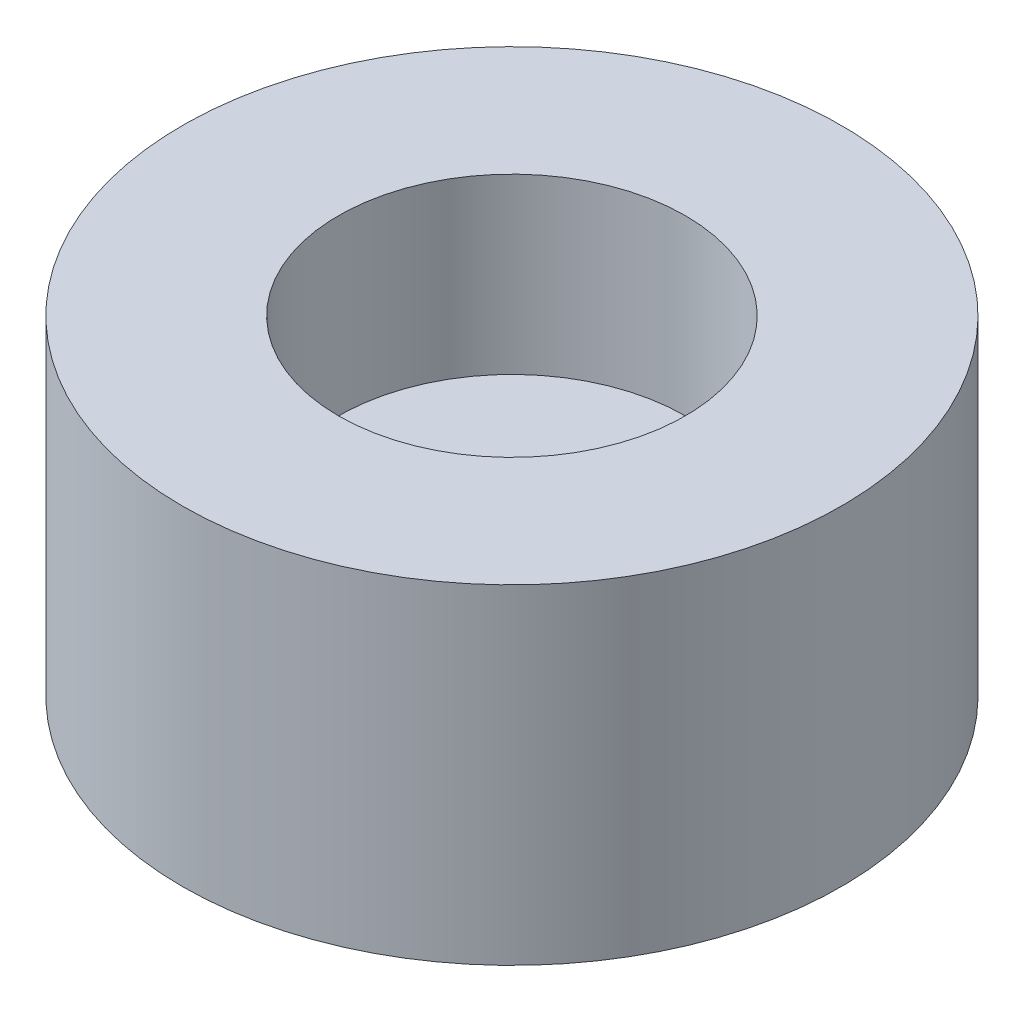
ISO-10303-21;
HEADER;
FILE_DESCRIPTION(('STEP AP214'),'2;1');
FILE_NAME('part.step','',(''),(''),'','','');
FILE_SCHEMA(('AUTOMOTIVE_DESIGN { 1 0 10303 214 1 1 1 1 }'));
ENDSEC;
DATA;
#1=APPLICATION_CONTEXT('core data for automotive mechanical design processes');
#2=APPLICATION_PROTOCOL_DEFINITION('international standard','automotive_design',2000,#1);
#3=PRODUCT_CONTEXT('',#1,'mechanical');
#4=PRODUCT('Part','Part','',(#3));
#5=PRODUCT_RELATED_PRODUCT_CATEGORY('part','',(#4));
#6=PRODUCT_DEFINITION_FORMATION('','',#4);
#7=PRODUCT_DEFINITION_CONTEXT('part definition',#1,'design');
#8=PRODUCT_DEFINITION('design','',#6,#7);
#9=PRODUCT_DEFINITION_SHAPE('','',#8);
#10=(LENGTH_UNIT() NAMED_UNIT(*) SI_UNIT(.MILLI.,.METRE.));
#11=(NAMED_UNIT(*) PLANE_ANGLE_UNIT() SI_UNIT($,.RADIAN.));
#12=(NAMED_UNIT(*) SI_UNIT($,.STERADIAN.) SOLID_ANGLE_UNIT());
#13=UNCERTAINTY_MEASURE_WITH_UNIT(LENGTH_MEASURE(1.E-05),#10,'distance_accuracy_value','');
#14=(GEOMETRIC_REPRESENTATION_CONTEXT(3) GLOBAL_UNCERTAINTY_ASSIGNED_CONTEXT((#13)) GLOBAL_UNIT_ASSIGNED_CONTEXT((#10,
#11,#12)) REPRESENTATION_CONTEXT('',''));
#15=CARTESIAN_POINT('',(0.,0.,0.));
#16=DIRECTION('',(0.,0.,1.));
#17=DIRECTION('',(1.,0.,0.));
#18=AXIS2_PLACEMENT_3D('',#15,#16,#17);
#19=CARTESIAN_POINT('',(0.,19.,0.));
#20=DIRECTION('',(0.,-1.,0.));
#21=DIRECTION('',(0.,0.,-1.));
#22=AXIS2_PLACEMENT_3D('',#19,#20,#21);
#23=CYLINDRICAL_SURFACE('',#22,19.);
#24=CARTESIAN_POINT('',(0.,19.,0.));
#25=DIRECTION('',(0.,1.,0.));
#26=DIRECTION('',(0.,0.,1.));
#27=AXIS2_PLACEMENT_3D('',#24,#25,#26);
#28=CIRCLE('',#27,19.);
#29=CARTESIAN_POINT('',(0.,19.,19.));
#30=VERTEX_POINT('',#29);
#31=EDGE_CURVE('E10',#30,#30,#28,.T.);
#32=ORIENTED_EDGE('',*,*,#31,.F.);
#33=EDGE_LOOP('',(#32));
#34=FACE_BOUND('',#33,.T.);
#35=CARTESIAN_POINT('',(0.,0.,0.));
#36=DIRECTION('',(0.,1.,0.));
#37=DIRECTION('',(0.,0.,1.));
#38=AXIS2_PLACEMENT_3D('',#35,#36,#37);
#39=CIRCLE('',#38,19.);
#40=CARTESIAN_POINT('',(0.,0.,19.));
#41=VERTEX_POINT('',#40);
#42=EDGE_CURVE('E42',#41,#41,#39,.T.);
#43=ORIENTED_EDGE('',*,*,#42,.T.);
#44=EDGE_LOOP('',(#43));
#45=FACE_BOUND('',#44,.T.);
#46=ADVANCED_FACE('F39',(#34,#45),#23,.T.);
#47=CARTESIAN_POINT('',(0.,19.,0.));
#48=DIRECTION('',(0.,1.,0.));
#49=DIRECTION('',(0.,0.,1.));
#50=AXIS2_PLACEMENT_3D('',#47,#48,#49);
#51=PLANE('',#50);
#52=CARTESIAN_POINT('',(0.,19.,0.));
#53=DIRECTION('',(0.,1.,0.));
#54=DIRECTION('',(0.,0.,1.));
#55=AXIS2_PLACEMENT_3D('',#52,#53,#54);
#56=CIRCLE('',#55,10.);
#57=CARTESIAN_POINT('',(0.,19.,10.));
#58=VERTEX_POINT('',#57);
#59=EDGE_CURVE('E53',#58,#58,#56,.T.);
#60=ORIENTED_EDGE('',*,*,#59,.F.);
#61=EDGE_LOOP('',(#60));
#62=FACE_BOUND('',#61,.T.);
#63=ORIENTED_EDGE('',*,*,#31,.T.);
#64=EDGE_LOOP('',(#63));
#65=FACE_BOUND('',#64,.T.);
#66=ADVANCED_FACE('F84',(#62,#65),#51,.T.);
#67=CARTESIAN_POINT('',(0.,0.,0.));
#68=DIRECTION('',(0.,1.,0.));
#69=DIRECTION('',(0.,0.,1.));
#70=AXIS2_PLACEMENT_3D('',#67,#68,#69);
#71=PLANE('',#70);
#72=CARTESIAN_POINT('',(0.,0.,0.));
#73=DIRECTION('',(0.,1.,0.));
#74=DIRECTION('',(0.,0.,1.));
#75=AXIS2_PLACEMENT_3D('',#72,#73,#74);
#76=CIRCLE('',#75,3.5);
#77=CARTESIAN_POINT('',(0.,0.,3.5));
#78=VERTEX_POINT('',#77);
#79=EDGE_CURVE('E57',#78,#78,#76,.F.);
#80=ORIENTED_EDGE('',*,*,#79,.F.);
#81=EDGE_LOOP('',(#80));
#82=FACE_BOUND('',#81,.T.);
#83=ORIENTED_EDGE('',*,*,#42,.F.);
#84=EDGE_LOOP('',(#83));
#85=FACE_BOUND('',#84,.T.);
#86=ADVANCED_FACE('F80',(#82,#85),#71,.F.);
#87=CARTESIAN_POINT('',(0.,9.,0.));
#88=DIRECTION('',(0.,1.,0.));
#89=DIRECTION('',(0.,0.,1.));
#90=AXIS2_PLACEMENT_3D('',#87,#88,#89);
#91=CYLINDRICAL_SURFACE('',#90,10.);
#92=CARTESIAN_POINT('',(0.,9.,0.));
#93=DIRECTION('',(0.,1.,0.));
#94=DIRECTION('',(0.,0.,1.));
#95=AXIS2_PLACEMENT_3D('',#92,#93,#94);
#96=CIRCLE('',#95,10.);
#97=CARTESIAN_POINT('',(0.,9.,10.));
#98=VERTEX_POINT('',#97);
#99=EDGE_CURVE('E51',#98,#98,#96,.T.);
#100=ORIENTED_EDGE('',*,*,#99,.F.);
#101=EDGE_LOOP('',(#100));
#102=FACE_BOUND('',#101,.T.);
#103=ORIENTED_EDGE('',*,*,#59,.T.);
#104=EDGE_LOOP('',(#103));
#105=FACE_BOUND('',#104,.T.);
#106=ADVANCED_FACE('F74',(#102,#105),#91,.F.);
#107=CARTESIAN_POINT('',(0.,9.,0.));
#108=DIRECTION('',(0.,1.,0.));
#109=DIRECTION('',(0.,0.,1.));
#110=AXIS2_PLACEMENT_3D('',#107,#108,#109);
#111=PLANE('',#110);
#112=CARTESIAN_POINT('',(0.,9.,0.));
#113=DIRECTION('',(0.,1.,0.));
#114=DIRECTION('',(0.,0.,1.));
#115=AXIS2_PLACEMENT_3D('',#112,#113,#114);
#116=CIRCLE('',#115,3.5);
#117=CARTESIAN_POINT('',(0.,9.,3.5));
#118=VERTEX_POINT('',#117);
#119=EDGE_CURVE('E64',#118,#118,#116,.T.);
#120=ORIENTED_EDGE('',*,*,#119,.F.);
#121=EDGE_LOOP('',(#120));
#122=FACE_BOUND('',#121,.T.);
#123=ORIENTED_EDGE('',*,*,#99,.T.);
#124=EDGE_LOOP('',(#123));
#125=FACE_BOUND('',#124,.T.);
#126=ADVANCED_FACE('F71',(#122,#125),#111,.T.);
#127=CARTESIAN_POINT('',(0.,-9.89949493661167,0.));
#128=DIRECTION('',(0.,1.,0.));
#129=DIRECTION('',(0.,0.,1.));
#130=AXIS2_PLACEMENT_3D('',#127,#128,#129);
#131=CYLINDRICAL_SURFACE('',#130,3.5);
#132=ORIENTED_EDGE('',*,*,#79,.T.);
#133=EDGE_LOOP('',(#132));
#134=FACE_BOUND('',#133,.T.);
#135=ORIENTED_EDGE('',*,*,#119,.T.);
#136=EDGE_LOOP('',(#135));
#137=FACE_BOUND('',#136,.T.);
#138=ADVANCED_FACE('F69',(#134,#137),#131,.F.);
#139=CLOSED_SHELL('',(#46,#66,#86,#106,#126,#138));
#140=MANIFOLD_SOLID_BREP('B2',#139);
#141=ADVANCED_BREP_SHAPE_REPRESENTATION('',(#18,#140),#14);
#142=SHAPE_DEFINITION_REPRESENTATION(#9,#141);
ENDSEC;
END-ISO-10303-21;
